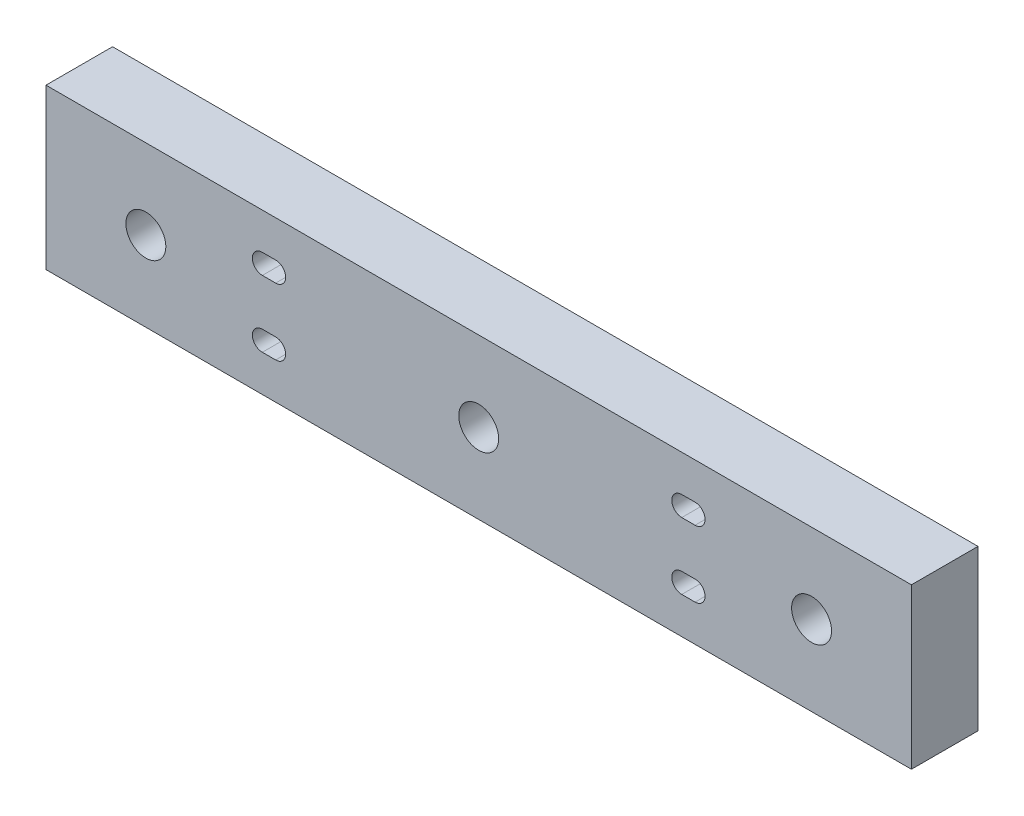
ISO-10303-21;
HEADER;
FILE_DESCRIPTION(('STEP AP214'),'2;1');
FILE_NAME('part.step','',(''),(''),'','','');
FILE_SCHEMA(('AUTOMOTIVE_DESIGN { 1 0 10303 214 1 1 1 1 }'));
ENDSEC;
DATA;
#1=APPLICATION_CONTEXT('core data for automotive mechanical design processes');
#2=APPLICATION_PROTOCOL_DEFINITION('international standard','automotive_design',2000,#1);
#3=PRODUCT_CONTEXT('',#1,'mechanical');
#4=PRODUCT('Part','Part','',(#3));
#5=PRODUCT_RELATED_PRODUCT_CATEGORY('part','',(#4));
#6=PRODUCT_DEFINITION_FORMATION('','',#4);
#7=PRODUCT_DEFINITION_CONTEXT('part definition',#1,'design');
#8=PRODUCT_DEFINITION('design','',#6,#7);
#9=PRODUCT_DEFINITION_SHAPE('','',#8);
#10=(LENGTH_UNIT() NAMED_UNIT(*) SI_UNIT(.MILLI.,.METRE.));
#11=(NAMED_UNIT(*) PLANE_ANGLE_UNIT() SI_UNIT($,.RADIAN.));
#12=(NAMED_UNIT(*) SI_UNIT($,.STERADIAN.) SOLID_ANGLE_UNIT());
#13=UNCERTAINTY_MEASURE_WITH_UNIT(LENGTH_MEASURE(1.E-05),#10,'distance_accuracy_value','');
#14=(GEOMETRIC_REPRESENTATION_CONTEXT(3) GLOBAL_UNCERTAINTY_ASSIGNED_CONTEXT((#13)) GLOBAL_UNIT_ASSIGNED_CONTEXT((#10,
#11,#12)) REPRESENTATION_CONTEXT('',''));
#15=CARTESIAN_POINT('',(0.,0.,0.));
#16=DIRECTION('',(0.,0.,1.));
#17=DIRECTION('',(1.,0.,0.));
#18=AXIS2_PLACEMENT_3D('',#15,#16,#17);
#19=CARTESIAN_POINT('',(0.,0.,0.));
#20=DIRECTION('',(0.,0.,-1.));
#21=DIRECTION('',(-1.,0.,0.));
#22=AXIS2_PLACEMENT_3D('',#19,#20,#21);
#23=PLANE('',#22);
#24=CARTESIAN_POINT('',(31.5,-5.,0.));
#25=DIRECTION('',(0.,0.,-1.));
#26=DIRECTION('',(-1.,0.,0.));
#27=AXIS2_PLACEMENT_3D('',#24,#25,#26);
#28=CIRCLE('',#27,4.);
#29=CARTESIAN_POINT('',(27.5,-5.,0.));
#30=VERTEX_POINT('',#29);
#31=EDGE_CURVE('E506',#30,#30,#28,.T.);
#32=ORIENTED_EDGE('',*,*,#31,.F.);
#33=EDGE_LOOP('',(#32));
#34=FACE_BOUND('',#33,.T.);
#35=CARTESIAN_POINT('',(-31.5,-5.,0.));
#36=DIRECTION('',(0.,0.,1.));
#37=DIRECTION('',(1.,0.,0.));
#38=AXIS2_PLACEMENT_3D('',#35,#36,#37);
#39=CIRCLE('',#38,4.);
#40=CARTESIAN_POINT('',(-27.5,-5.,0.));
#41=VERTEX_POINT('',#40);
#42=EDGE_CURVE('E512',#41,#41,#39,.T.);
#43=ORIENTED_EDGE('',*,*,#42,.T.);
#44=EDGE_LOOP('',(#43));
#45=FACE_BOUND('',#44,.T.);
#46=CARTESIAN_POINT('',(31.5,5.,0.));
#47=DIRECTION('',(0.,0.,-1.));
#48=DIRECTION('',(-1.,0.,0.));
#49=AXIS2_PLACEMENT_3D('',#46,#47,#48);
#50=CIRCLE('',#49,4.);
#51=CARTESIAN_POINT('',(27.5,5.,0.));
#52=VERTEX_POINT('',#51);
#53=EDGE_CURVE('E503',#52,#52,#50,.T.);
#54=ORIENTED_EDGE('',*,*,#53,.F.);
#55=EDGE_LOOP('',(#54));
#56=FACE_BOUND('',#55,.T.);
#57=CARTESIAN_POINT('',(-50.,0.,0.));
#58=DIRECTION('',(0.,0.,1.));
#59=DIRECTION('',(1.,0.,0.));
#60=AXIS2_PLACEMENT_3D('',#57,#58,#59);
#61=CIRCLE('',#60,3.);
#62=CARTESIAN_POINT('',(-47.,0.,0.));
#63=VERTEX_POINT('',#62);
#64=EDGE_CURVE('E257',#63,#63,#61,.T.);
#65=ORIENTED_EDGE('',*,*,#64,.T.);
#66=EDGE_LOOP('',(#65));
#67=FACE_BOUND('',#66,.T.);
#68=DIRECTION('',(0.,1.,0.));
#69=VECTOR('',#68,1.);
#70=CARTESIAN_POINT('',(65.,-12.,0.));
#71=LINE('',#70,#69);
#72=CARTESIAN_POINT('',(65.,-12.,0.));
#73=VERTEX_POINT('',#72);
#74=CARTESIAN_POINT('',(65.,12.,0.));
#75=VERTEX_POINT('',#74);
#76=EDGE_CURVE('E292',#73,#75,#71,.T.);
#77=ORIENTED_EDGE('',*,*,#76,.F.);
#78=DIRECTION('',(1.,0.,0.));
#79=VECTOR('',#78,1.);
#80=CARTESIAN_POINT('',(-65.,-12.,0.));
#81=LINE('',#80,#79);
#82=CARTESIAN_POINT('',(-65.,-12.,0.));
#83=VERTEX_POINT('',#82);
#84=EDGE_CURVE('E297',#83,#73,#81,.T.);
#85=ORIENTED_EDGE('',*,*,#84,.F.);
#86=DIRECTION('',(0.,-1.,0.));
#87=VECTOR('',#86,1.);
#88=CARTESIAN_POINT('',(-65.,-12.,0.));
#89=LINE('',#88,#87);
#90=CARTESIAN_POINT('',(-65.,12.,0.));
#91=VERTEX_POINT('',#90);
#92=EDGE_CURVE('E308',#91,#83,#89,.T.);
#93=ORIENTED_EDGE('',*,*,#92,.F.);
#94=DIRECTION('',(-1.,0.,0.));
#95=VECTOR('',#94,1.);
#96=CARTESIAN_POINT('',(-65.,12.,0.));
#97=LINE('',#96,#95);
#98=EDGE_CURVE('E306',#75,#91,#97,.T.);
#99=ORIENTED_EDGE('',*,*,#98,.F.);
#100=EDGE_LOOP('',(#77,#85,#93,#99));
#101=FACE_BOUND('',#100,.T.);
#102=CARTESIAN_POINT('',(0.,0.,0.));
#103=DIRECTION('',(0.,0.,1.));
#104=DIRECTION('',(1.,0.,0.));
#105=AXIS2_PLACEMENT_3D('',#102,#103,#104);
#106=CIRCLE('',#105,3.);
#107=CARTESIAN_POINT('',(3.,0.,0.));
#108=VERTEX_POINT('',#107);
#109=EDGE_CURVE('E263',#108,#108,#106,.T.);
#110=ORIENTED_EDGE('',*,*,#109,.T.);
#111=EDGE_LOOP('',(#110));
#112=FACE_BOUND('',#111,.T.);
#113=CARTESIAN_POINT('',(50.,0.,0.));
#114=DIRECTION('',(0.,0.,1.));
#115=DIRECTION('',(1.,0.,0.));
#116=AXIS2_PLACEMENT_3D('',#113,#114,#115);
#117=CIRCLE('',#116,3.);
#118=CARTESIAN_POINT('',(53.,0.,0.));
#119=VERTEX_POINT('',#118);
#120=EDGE_CURVE('E253',#119,#119,#117,.T.);
#121=ORIENTED_EDGE('',*,*,#120,.T.);
#122=EDGE_LOOP('',(#121));
#123=FACE_BOUND('',#122,.T.);
#124=CARTESIAN_POINT('',(-31.5,5.,0.));
#125=DIRECTION('',(0.,0.,1.));
#126=DIRECTION('',(1.,0.,0.));
#127=AXIS2_PLACEMENT_3D('',#124,#125,#126);
#128=CIRCLE('',#127,4.);
#129=CARTESIAN_POINT('',(-27.5,5.,0.));
#130=VERTEX_POINT('',#129);
#131=EDGE_CURVE('E511',#130,#130,#128,.T.);
#132=ORIENTED_EDGE('',*,*,#131,.T.);
#133=EDGE_LOOP('',(#132));
#134=FACE_BOUND('',#133,.T.);
#135=ADVANCED_FACE('F37',(#34,#45,#56,#67,#101,#112,#123,#134),#23,.T.);
#136=CARTESIAN_POINT('',(32.5,5.,10.));
#137=DIRECTION('',(0.,0.,-1.));
#138=DIRECTION('',(-1.,0.,0.));
#139=AXIS2_PLACEMENT_3D('',#136,#137,#138);
#140=CYLINDRICAL_SURFACE('',#139,1.5);
#141=DIRECTION('',(0.,0.,-1.));
#142=VECTOR('',#141,1.);
#143=CARTESIAN_POINT('',(32.5,6.5,10.));
#144=LINE('',#143,#142);
#145=CARTESIAN_POINT('',(32.5,6.5,10.));
#146=VERTEX_POINT('',#145);
#147=CARTESIAN_POINT('',(32.5,6.5,7.));
#148=VERTEX_POINT('',#147);
#149=EDGE_CURVE('E289',#146,#148,#144,.T.);
#150=ORIENTED_EDGE('',*,*,#149,.T.);
#151=CARTESIAN_POINT('',(32.5,5.,7.));
#152=DIRECTION('',(0.,0.,-1.));
#153=DIRECTION('',(-1.,0.,0.));
#154=AXIS2_PLACEMENT_3D('',#151,#152,#153);
#155=CIRCLE('',#154,1.5);
#156=CARTESIAN_POINT('',(32.5,3.49999999999999,7.));
#157=VERTEX_POINT('',#156);
#158=EDGE_CURVE('E349',#148,#157,#155,.T.);
#159=ORIENTED_EDGE('',*,*,#158,.T.);
#160=DIRECTION('',(0.,0.,-1.));
#161=VECTOR('',#160,1.);
#162=CARTESIAN_POINT('',(32.5,3.49999999999999,10.));
#163=LINE('',#162,#161);
#164=CARTESIAN_POINT('',(32.5,3.49999999999999,10.));
#165=VERTEX_POINT('',#164);
#166=EDGE_CURVE('E280',#165,#157,#163,.T.);
#167=ORIENTED_EDGE('',*,*,#166,.F.);
#168=CARTESIAN_POINT('',(32.5,5.,10.));
#169=DIRECTION('',(0.,0.,1.));
#170=DIRECTION('',(-1.,0.,0.));
#171=AXIS2_PLACEMENT_3D('',#168,#169,#170);
#172=CIRCLE('',#171,1.5);
#173=EDGE_CURVE('E269',#165,#146,#172,.T.);
#174=ORIENTED_EDGE('',*,*,#173,.T.);
#175=EDGE_LOOP('',(#150,#159,#167,#174));
#176=FACE_BOUND('',#175,.T.);
#177=ADVANCED_FACE('F405',(#176),#140,.F.);
#178=CARTESIAN_POINT('',(32.5,6.5,10.));
#179=DIRECTION('',(0.,-1.,0.));
#180=DIRECTION('',(0.,0.,-1.));
#181=AXIS2_PLACEMENT_3D('',#178,#179,#180);
#182=PLANE('',#181);
#183=DIRECTION('',(0.,0.,-1.));
#184=VECTOR('',#183,1.);
#185=CARTESIAN_POINT('',(30.5,6.5,10.));
#186=LINE('',#185,#184);
#187=CARTESIAN_POINT('',(30.5,6.5,10.));
#188=VERTEX_POINT('',#187);
#189=CARTESIAN_POINT('',(30.5,6.5,7.));
#190=VERTEX_POINT('',#189);
#191=EDGE_CURVE('E286',#188,#190,#186,.T.);
#192=ORIENTED_EDGE('',*,*,#191,.T.);
#193=DIRECTION('',(1.,0.,0.));
#194=VECTOR('',#193,1.);
#195=CARTESIAN_POINT('',(32.5,6.5,7.));
#196=LINE('',#195,#194);
#197=EDGE_CURVE('E342',#190,#148,#196,.T.);
#198=ORIENTED_EDGE('',*,*,#197,.T.);
#199=ORIENTED_EDGE('',*,*,#149,.F.);
#200=DIRECTION('',(-1.,0.,0.));
#201=VECTOR('',#200,1.);
#202=CARTESIAN_POINT('',(32.5,6.5,10.));
#203=LINE('',#202,#201);
#204=EDGE_CURVE('E273',#146,#188,#203,.T.);
#205=ORIENTED_EDGE('',*,*,#204,.T.);
#206=EDGE_LOOP('',(#192,#198,#199,#205));
#207=FACE_BOUND('',#206,.T.);
#208=ADVANCED_FACE('F411',(#207),#182,.T.);
#209=CARTESIAN_POINT('',(30.5,5.,10.));
#210=DIRECTION('',(0.,0.,-1.));
#211=DIRECTION('',(-1.,0.,0.));
#212=AXIS2_PLACEMENT_3D('',#209,#210,#211);
#213=CYLINDRICAL_SURFACE('',#212,1.5);
#214=DIRECTION('',(0.,0.,-1.));
#215=VECTOR('',#214,1.);
#216=CARTESIAN_POINT('',(30.5,3.49999999999999,10.));
#217=LINE('',#216,#215);
#218=CARTESIAN_POINT('',(30.5,3.49999999999999,10.));
#219=VERTEX_POINT('',#218);
#220=CARTESIAN_POINT('',(30.5,3.49999999999999,7.));
#221=VERTEX_POINT('',#220);
#222=EDGE_CURVE('E283',#219,#221,#217,.T.);
#223=ORIENTED_EDGE('',*,*,#222,.T.);
#224=CARTESIAN_POINT('',(30.5,5.,7.));
#225=DIRECTION('',(0.,0.,-1.));
#226=DIRECTION('',(-1.,0.,0.));
#227=AXIS2_PLACEMENT_3D('',#224,#225,#226);
#228=CIRCLE('',#227,1.5);
#229=EDGE_CURVE('E52',#221,#190,#228,.T.);
#230=ORIENTED_EDGE('',*,*,#229,.T.);
#231=ORIENTED_EDGE('',*,*,#191,.F.);
#232=CARTESIAN_POINT('',(30.5,5.,10.));
#233=DIRECTION('',(0.,0.,1.));
#234=DIRECTION('',(1.,0.,0.));
#235=AXIS2_PLACEMENT_3D('',#232,#233,#234);
#236=CIRCLE('',#235,1.5);
#237=EDGE_CURVE('E275',#188,#219,#236,.T.);
#238=ORIENTED_EDGE('',*,*,#237,.T.);
#239=EDGE_LOOP('',(#223,#230,#231,#238));
#240=FACE_BOUND('',#239,.T.);
#241=ADVANCED_FACE('F478',(#240),#213,.F.);
#242=CARTESIAN_POINT('',(32.5,3.49999999999999,10.));
#243=DIRECTION('',(0.,1.,0.));
#244=DIRECTION('',(0.,0.,1.));
#245=AXIS2_PLACEMENT_3D('',#242,#243,#244);
#246=PLANE('',#245);
#247=ORIENTED_EDGE('',*,*,#166,.T.);
#248=DIRECTION('',(-1.,0.,0.));
#249=VECTOR('',#248,1.);
#250=CARTESIAN_POINT('',(32.5,3.49999999999999,7.));
#251=LINE('',#250,#249);
#252=EDGE_CURVE('E11',#157,#221,#251,.T.);
#253=ORIENTED_EDGE('',*,*,#252,.T.);
#254=ORIENTED_EDGE('',*,*,#222,.F.);
#255=DIRECTION('',(1.,0.,0.));
#256=VECTOR('',#255,1.);
#257=CARTESIAN_POINT('',(32.5,3.49999999999999,10.));
#258=LINE('',#257,#256);
#259=EDGE_CURVE('E278',#219,#165,#258,.T.);
#260=ORIENTED_EDGE('',*,*,#259,.T.);
#261=EDGE_LOOP('',(#247,#253,#254,#260));
#262=FACE_BOUND('',#261,.T.);
#263=ADVANCED_FACE('F464',(#262),#246,.T.);
#264=CARTESIAN_POINT('',(32.5,-5.,10.));
#265=DIRECTION('',(0.,0.,-1.));
#266=DIRECTION('',(-1.,0.,0.));
#267=AXIS2_PLACEMENT_3D('',#264,#265,#266);
#268=CYLINDRICAL_SURFACE('',#267,1.5);
#269=DIRECTION('',(0.,0.,-1.));
#270=VECTOR('',#269,1.);
#271=CARTESIAN_POINT('',(32.5,-3.49999999999999,10.));
#272=LINE('',#271,#270);
#273=CARTESIAN_POINT('',(32.5,-3.49999999999999,10.));
#274=VERTEX_POINT('',#273);
#275=CARTESIAN_POINT('',(32.5,-3.49999999999999,7.));
#276=VERTEX_POINT('',#275);
#277=EDGE_CURVE('E250',#274,#276,#272,.T.);
#278=ORIENTED_EDGE('',*,*,#277,.T.);
#279=CARTESIAN_POINT('',(32.5,-5.,7.));
#280=DIRECTION('',(0.,0.,-1.));
#281=DIRECTION('',(-1.,0.,0.));
#282=AXIS2_PLACEMENT_3D('',#279,#280,#281);
#283=CIRCLE('',#282,1.5);
#284=CARTESIAN_POINT('',(32.5,-6.5,7.));
#285=VERTEX_POINT('',#284);
#286=EDGE_CURVE('E338',#276,#285,#283,.T.);
#287=ORIENTED_EDGE('',*,*,#286,.T.);
#288=DIRECTION('',(0.,0.,-1.));
#289=VECTOR('',#288,1.);
#290=CARTESIAN_POINT('',(32.5,-6.5,10.));
#291=LINE('',#290,#289);
#292=CARTESIAN_POINT('',(32.5,-6.5,10.));
#293=VERTEX_POINT('',#292);
#294=EDGE_CURVE('E241',#293,#285,#291,.T.);
#295=ORIENTED_EDGE('',*,*,#294,.F.);
#296=CARTESIAN_POINT('',(32.5,-5.,10.));
#297=DIRECTION('',(0.,0.,1.));
#298=DIRECTION('',(1.,0.,0.));
#299=AXIS2_PLACEMENT_3D('',#296,#297,#298);
#300=CIRCLE('',#299,1.5);
#301=EDGE_CURVE('E232',#293,#274,#300,.T.);
#302=ORIENTED_EDGE('',*,*,#301,.T.);
#303=EDGE_LOOP('',(#278,#287,#295,#302));
#304=FACE_BOUND('',#303,.T.);
#305=ADVANCED_FACE('F336',(#304),#268,.F.);
#306=CARTESIAN_POINT('',(32.5,-3.49999999999999,10.));
#307=DIRECTION('',(0.,-1.,0.));
#308=DIRECTION('',(0.,0.,-1.));
#309=AXIS2_PLACEMENT_3D('',#306,#307,#308);
#310=PLANE('',#309);
#311=DIRECTION('',(0.,0.,-1.));
#312=VECTOR('',#311,1.);
#313=CARTESIAN_POINT('',(30.5,-3.49999999999999,10.));
#314=LINE('',#313,#312);
#315=CARTESIAN_POINT('',(30.5,-3.49999999999999,10.));
#316=VERTEX_POINT('',#315);
#317=CARTESIAN_POINT('',(30.5,-3.49999999999999,7.));
#318=VERTEX_POINT('',#317);
#319=EDGE_CURVE('E247',#316,#318,#314,.T.);
#320=ORIENTED_EDGE('',*,*,#319,.T.);
#321=DIRECTION('',(1.,0.,0.));
#322=VECTOR('',#321,1.);
#323=CARTESIAN_POINT('',(32.5,-3.49999999999999,7.));
#324=LINE('',#323,#322);
#325=EDGE_CURVE('E340',#318,#276,#324,.T.);
#326=ORIENTED_EDGE('',*,*,#325,.T.);
#327=ORIENTED_EDGE('',*,*,#277,.F.);
#328=DIRECTION('',(-1.,0.,0.));
#329=VECTOR('',#328,1.);
#330=CARTESIAN_POINT('',(32.5,-3.49999999999999,10.));
#331=LINE('',#330,#329);
#332=EDGE_CURVE('E234',#274,#316,#331,.T.);
#333=ORIENTED_EDGE('',*,*,#332,.T.);
#334=EDGE_LOOP('',(#320,#326,#327,#333));
#335=FACE_BOUND('',#334,.T.);
#336=ADVANCED_FACE('F454',(#335),#310,.T.);
#337=CARTESIAN_POINT('',(30.5,-5.,10.));
#338=DIRECTION('',(0.,0.,-1.));
#339=DIRECTION('',(-1.,0.,0.));
#340=AXIS2_PLACEMENT_3D('',#337,#338,#339);
#341=CYLINDRICAL_SURFACE('',#340,1.5);
#342=DIRECTION('',(0.,0.,-1.));
#343=VECTOR('',#342,1.);
#344=CARTESIAN_POINT('',(30.5,-6.5,10.));
#345=LINE('',#344,#343);
#346=CARTESIAN_POINT('',(30.5,-6.5,10.));
#347=VERTEX_POINT('',#346);
#348=CARTESIAN_POINT('',(30.5,-6.5,7.));
#349=VERTEX_POINT('',#348);
#350=EDGE_CURVE('E244',#347,#349,#345,.T.);
#351=ORIENTED_EDGE('',*,*,#350,.T.);
#352=CARTESIAN_POINT('',(30.5,-5.,7.));
#353=DIRECTION('',(0.,0.,-1.));
#354=DIRECTION('',(-1.,0.,0.));
#355=AXIS2_PLACEMENT_3D('',#352,#353,#354);
#356=CIRCLE('',#355,1.5);
#357=EDGE_CURVE('E59',#349,#318,#356,.T.);
#358=ORIENTED_EDGE('',*,*,#357,.T.);
#359=ORIENTED_EDGE('',*,*,#319,.F.);
#360=CARTESIAN_POINT('',(30.5,-5.,10.));
#361=DIRECTION('',(0.,0.,1.));
#362=DIRECTION('',(-1.,0.,0.));
#363=AXIS2_PLACEMENT_3D('',#360,#361,#362);
#364=CIRCLE('',#363,1.5);
#365=EDGE_CURVE('E236',#316,#347,#364,.T.);
#366=ORIENTED_EDGE('',*,*,#365,.T.);
#367=EDGE_LOOP('',(#351,#358,#359,#366));
#368=FACE_BOUND('',#367,.T.);
#369=ADVANCED_FACE('F326',(#368),#341,.F.);
#370=CARTESIAN_POINT('',(32.5,-6.5,10.));
#371=DIRECTION('',(0.,1.,0.));
#372=DIRECTION('',(0.,0.,1.));
#373=AXIS2_PLACEMENT_3D('',#370,#371,#372);
#374=PLANE('',#373);
#375=ORIENTED_EDGE('',*,*,#294,.T.);
#376=DIRECTION('',(-1.,0.,0.));
#377=VECTOR('',#376,1.);
#378=CARTESIAN_POINT('',(32.5,-6.5,7.));
#379=LINE('',#378,#377);
#380=EDGE_CURVE('E45',#285,#349,#379,.T.);
#381=ORIENTED_EDGE('',*,*,#380,.T.);
#382=ORIENTED_EDGE('',*,*,#350,.F.);
#383=DIRECTION('',(1.,0.,0.));
#384=VECTOR('',#383,1.);
#385=CARTESIAN_POINT('',(32.5,-6.5,10.));
#386=LINE('',#385,#384);
#387=EDGE_CURVE('E239',#347,#293,#386,.T.);
#388=ORIENTED_EDGE('',*,*,#387,.T.);
#389=EDGE_LOOP('',(#375,#381,#382,#388));
#390=FACE_BOUND('',#389,.T.);
#391=ADVANCED_FACE('F322',(#390),#374,.T.);
#392=CARTESIAN_POINT('',(0.,0.,10.));
#393=DIRECTION('',(0.,0.,-1.));
#394=DIRECTION('',(-1.,0.,0.));
#395=AXIS2_PLACEMENT_3D('',#392,#393,#394);
#396=PLANE('',#395);
#397=CARTESIAN_POINT('',(-32.5,5.,10.));
#398=DIRECTION('',(0.,0.,1.));
#399=DIRECTION('',(1.,0.,0.));
#400=AXIS2_PLACEMENT_3D('',#397,#398,#399);
#401=CIRCLE('',#400,1.5);
#402=CARTESIAN_POINT('',(-32.5,6.5,10.));
#403=VERTEX_POINT('',#402);
#404=CARTESIAN_POINT('',(-32.5,3.49999999999999,10.));
#405=VERTEX_POINT('',#404);
#406=EDGE_CURVE('E211',#403,#405,#401,.T.);
#407=ORIENTED_EDGE('',*,*,#406,.F.);
#408=DIRECTION('',(-1.,0.,0.));
#409=VECTOR('',#408,1.);
#410=CARTESIAN_POINT('',(-32.5,6.5,10.));
#411=LINE('',#410,#409);
#412=CARTESIAN_POINT('',(-30.5,6.5,10.));
#413=VERTEX_POINT('',#412);
#414=EDGE_CURVE('E218',#413,#403,#411,.T.);
#415=ORIENTED_EDGE('',*,*,#414,.F.);
#416=CARTESIAN_POINT('',(-30.5,5.,10.));
#417=DIRECTION('',(0.,0.,1.));
#418=DIRECTION('',(-1.,0.,0.));
#419=AXIS2_PLACEMENT_3D('',#416,#417,#418);
#420=CIRCLE('',#419,1.5);
#421=CARTESIAN_POINT('',(-30.5,3.49999999999999,10.));
#422=VERTEX_POINT('',#421);
#423=EDGE_CURVE('E215',#422,#413,#420,.T.);
#424=ORIENTED_EDGE('',*,*,#423,.F.);
#425=DIRECTION('',(1.,0.,0.));
#426=VECTOR('',#425,1.);
#427=CARTESIAN_POINT('',(-32.5,3.49999999999999,10.));
#428=LINE('',#427,#426);
#429=EDGE_CURVE('E213',#405,#422,#428,.T.);
#430=ORIENTED_EDGE('',*,*,#429,.F.);
#431=EDGE_LOOP('',(#407,#415,#424,#430));
#432=FACE_BOUND('',#431,.T.);
#433=CARTESIAN_POINT('',(50.,0.,10.));
#434=DIRECTION('',(0.,0.,1.));
#435=DIRECTION('',(1.,0.,0.));
#436=AXIS2_PLACEMENT_3D('',#433,#434,#435);
#437=CIRCLE('',#436,3.);
#438=CARTESIAN_POINT('',(53.,0.,10.));
#439=VERTEX_POINT('',#438);
#440=EDGE_CURVE('E254',#439,#439,#437,.T.);
#441=ORIENTED_EDGE('',*,*,#440,.F.);
#442=EDGE_LOOP('',(#441));
#443=FACE_BOUND('',#442,.T.);
#444=CARTESIAN_POINT('',(-50.,0.,10.));
#445=DIRECTION('',(0.,0.,1.));
#446=DIRECTION('',(1.,0.,0.));
#447=AXIS2_PLACEMENT_3D('',#444,#445,#446);
#448=CIRCLE('',#447,3.);
#449=CARTESIAN_POINT('',(-47.,0.,10.));
#450=VERTEX_POINT('',#449);
#451=EDGE_CURVE('E260',#450,#450,#448,.T.);
#452=ORIENTED_EDGE('',*,*,#451,.F.);
#453=EDGE_LOOP('',(#452));
#454=FACE_BOUND('',#453,.T.);
#455=CARTESIAN_POINT('',(0.,0.,10.));
#456=DIRECTION('',(0.,0.,1.));
#457=DIRECTION('',(1.,0.,0.));
#458=AXIS2_PLACEMENT_3D('',#455,#456,#457);
#459=CIRCLE('',#458,3.);
#460=CARTESIAN_POINT('',(3.,0.,10.));
#461=VERTEX_POINT('',#460);
#462=EDGE_CURVE('E266',#461,#461,#459,.T.);
#463=ORIENTED_EDGE('',*,*,#462,.F.);
#464=EDGE_LOOP('',(#463));
#465=FACE_BOUND('',#464,.T.);
#466=ORIENTED_EDGE('',*,*,#173,.F.);
#467=ORIENTED_EDGE('',*,*,#259,.F.);
#468=ORIENTED_EDGE('',*,*,#237,.F.);
#469=ORIENTED_EDGE('',*,*,#204,.F.);
#470=EDGE_LOOP('',(#466,#467,#468,#469));
#471=FACE_BOUND('',#470,.T.);
#472=DIRECTION('',(0.,1.,0.));
#473=VECTOR('',#472,1.);
#474=CARTESIAN_POINT('',(65.,-12.,10.));
#475=LINE('',#474,#473);
#476=CARTESIAN_POINT('',(65.,-12.,10.));
#477=VERTEX_POINT('',#476);
#478=CARTESIAN_POINT('',(65.,12.,10.));
#479=VERTEX_POINT('',#478);
#480=EDGE_CURVE('E293',#477,#479,#475,.T.);
#481=ORIENTED_EDGE('',*,*,#480,.T.);
#482=DIRECTION('',(-1.,0.,0.));
#483=VECTOR('',#482,1.);
#484=CARTESIAN_POINT('',(-65.,12.,10.));
#485=LINE('',#484,#483);
#486=CARTESIAN_POINT('',(-65.,12.,10.));
#487=VERTEX_POINT('',#486);
#488=EDGE_CURVE('E296',#479,#487,#485,.T.);
#489=ORIENTED_EDGE('',*,*,#488,.T.);
#490=DIRECTION('',(0.,-1.,0.));
#491=VECTOR('',#490,1.);
#492=CARTESIAN_POINT('',(-65.,-12.,10.));
#493=LINE('',#492,#491);
#494=CARTESIAN_POINT('',(-65.,-12.,10.));
#495=VERTEX_POINT('',#494);
#496=EDGE_CURVE('E299',#487,#495,#493,.T.);
#497=ORIENTED_EDGE('',*,*,#496,.T.);
#498=DIRECTION('',(1.,0.,0.));
#499=VECTOR('',#498,1.);
#500=CARTESIAN_POINT('',(-65.,-12.,10.));
#501=LINE('',#500,#499);
#502=EDGE_CURVE('E301',#495,#477,#501,.T.);
#503=ORIENTED_EDGE('',*,*,#502,.T.);
#504=EDGE_LOOP('',(#481,#489,#497,#503));
#505=FACE_BOUND('',#504,.T.);
#506=ORIENTED_EDGE('',*,*,#301,.F.);
#507=ORIENTED_EDGE('',*,*,#387,.F.);
#508=ORIENTED_EDGE('',*,*,#365,.F.);
#509=ORIENTED_EDGE('',*,*,#332,.F.);
#510=EDGE_LOOP('',(#506,#507,#508,#509));
#511=FACE_BOUND('',#510,.T.);
#512=CARTESIAN_POINT('',(-32.5,-5.,10.));
#513=DIRECTION('',(0.,0.,1.));
#514=DIRECTION('',(-1.,0.,0.));
#515=AXIS2_PLACEMENT_3D('',#512,#513,#514);
#516=CIRCLE('',#515,1.5);
#517=CARTESIAN_POINT('',(-32.5,-3.49999999999999,10.));
#518=VERTEX_POINT('',#517);
#519=CARTESIAN_POINT('',(-32.5,-6.5,10.));
#520=VERTEX_POINT('',#519);
#521=EDGE_CURVE('E352',#518,#520,#516,.T.);
#522=ORIENTED_EDGE('',*,*,#521,.F.);
#523=DIRECTION('',(-1.,0.,0.));
#524=VECTOR('',#523,1.);
#525=CARTESIAN_POINT('',(-32.5,-3.49999999999999,10.));
#526=LINE('',#525,#524);
#527=CARTESIAN_POINT('',(-30.5,-3.49999999999999,10.));
#528=VERTEX_POINT('',#527);
#529=EDGE_CURVE('E199',#528,#518,#526,.T.);
#530=ORIENTED_EDGE('',*,*,#529,.F.);
#531=CARTESIAN_POINT('',(-30.5,-5.,10.));
#532=DIRECTION('',(0.,0.,1.));
#533=DIRECTION('',(1.,0.,0.));
#534=AXIS2_PLACEMENT_3D('',#531,#532,#533);
#535=CIRCLE('',#534,1.5);
#536=CARTESIAN_POINT('',(-30.5,-6.5,10.));
#537=VERTEX_POINT('',#536);
#538=EDGE_CURVE('E204',#537,#528,#535,.T.);
#539=ORIENTED_EDGE('',*,*,#538,.F.);
#540=DIRECTION('',(1.,0.,0.));
#541=VECTOR('',#540,1.);
#542=CARTESIAN_POINT('',(-32.5,-6.5,10.));
#543=LINE('',#542,#541);
#544=EDGE_CURVE('E354',#520,#537,#543,.T.);
#545=ORIENTED_EDGE('',*,*,#544,.F.);
#546=EDGE_LOOP('',(#522,#530,#539,#545));
#547=FACE_BOUND('',#546,.T.);
#548=ADVANCED_FACE('F333',(#432,#443,#454,#465,#471,#505,#511,#547),#396,.F.);
#549=CARTESIAN_POINT('',(65.,-12.,10.));
#550=DIRECTION('',(-1.,0.,0.));
#551=DIRECTION('',(0.,0.,1.));
#552=AXIS2_PLACEMENT_3D('',#549,#550,#551);
#553=PLANE('',#552);
#554=ORIENTED_EDGE('',*,*,#76,.T.);
#555=DIRECTION('',(0.,0.,-1.));
#556=VECTOR('',#555,1.);
#557=CARTESIAN_POINT('',(65.,12.,10.));
#558=LINE('',#557,#556);
#559=EDGE_CURVE('E184',#479,#75,#558,.T.);
#560=ORIENTED_EDGE('',*,*,#559,.F.);
#561=ORIENTED_EDGE('',*,*,#480,.F.);
#562=DIRECTION('',(0.,0.,-1.));
#563=VECTOR('',#562,1.);
#564=CARTESIAN_POINT('',(65.,-12.,10.));
#565=LINE('',#564,#563);
#566=EDGE_CURVE('E303',#477,#73,#565,.T.);
#567=ORIENTED_EDGE('',*,*,#566,.T.);
#568=EDGE_LOOP('',(#554,#560,#561,#567));
#569=FACE_BOUND('',#568,.T.);
#570=ADVANCED_FACE('F39',(#569),#553,.F.);
#571=CARTESIAN_POINT('',(-65.,12.,10.));
#572=DIRECTION('',(0.,-1.,0.));
#573=DIRECTION('',(0.,0.,-1.));
#574=AXIS2_PLACEMENT_3D('',#571,#572,#573);
#575=PLANE('',#574);
#576=ORIENTED_EDGE('',*,*,#98,.T.);
#577=DIRECTION('',(0.,0.,-1.));
#578=VECTOR('',#577,1.);
#579=CARTESIAN_POINT('',(-65.,12.,10.));
#580=LINE('',#579,#578);
#581=EDGE_CURVE('E316',#487,#91,#580,.T.);
#582=ORIENTED_EDGE('',*,*,#581,.F.);
#583=ORIENTED_EDGE('',*,*,#488,.F.);
#584=ORIENTED_EDGE('',*,*,#559,.T.);
#585=EDGE_LOOP('',(#576,#582,#583,#584));
#586=FACE_BOUND('',#585,.T.);
#587=ADVANCED_FACE('F425',(#586),#575,.F.);
#588=CARTESIAN_POINT('',(-65.,-12.,10.));
#589=DIRECTION('',(1.,0.,0.));
#590=DIRECTION('',(0.,0.,-1.));
#591=AXIS2_PLACEMENT_3D('',#588,#589,#590);
#592=PLANE('',#591);
#593=ORIENTED_EDGE('',*,*,#92,.T.);
#594=DIRECTION('',(0.,0.,-1.));
#595=VECTOR('',#594,1.);
#596=CARTESIAN_POINT('',(-65.,-12.,10.));
#597=LINE('',#596,#595);
#598=EDGE_CURVE('E313',#495,#83,#597,.T.);
#599=ORIENTED_EDGE('',*,*,#598,.F.);
#600=ORIENTED_EDGE('',*,*,#496,.F.);
#601=ORIENTED_EDGE('',*,*,#581,.T.);
#602=EDGE_LOOP('',(#593,#599,#600,#601));
#603=FACE_BOUND('',#602,.T.);
#604=ADVANCED_FACE('F422',(#603),#592,.F.);
#605=CARTESIAN_POINT('',(-65.,-12.,10.));
#606=DIRECTION('',(0.,1.,0.));
#607=DIRECTION('',(0.,0.,1.));
#608=AXIS2_PLACEMENT_3D('',#605,#606,#607);
#609=PLANE('',#608);
#610=ORIENTED_EDGE('',*,*,#84,.T.);
#611=ORIENTED_EDGE('',*,*,#566,.F.);
#612=ORIENTED_EDGE('',*,*,#502,.F.);
#613=ORIENTED_EDGE('',*,*,#598,.T.);
#614=EDGE_LOOP('',(#610,#611,#612,#613));
#615=FACE_BOUND('',#614,.T.);
#616=ADVANCED_FACE('F418',(#615),#609,.F.);
#617=CARTESIAN_POINT('',(0.,0.,10.));
#618=DIRECTION('',(0.,0.,-1.));
#619=DIRECTION('',(-1.,0.,0.));
#620=AXIS2_PLACEMENT_3D('',#617,#618,#619);
#621=CYLINDRICAL_SURFACE('',#620,3.);
#622=ORIENTED_EDGE('',*,*,#462,.T.);
#623=EDGE_LOOP('',(#622));
#624=FACE_BOUND('',#623,.T.);
#625=ORIENTED_EDGE('',*,*,#109,.F.);
#626=EDGE_LOOP('',(#625));
#627=FACE_BOUND('',#626,.T.);
#628=ADVANCED_FACE('F421',(#624,#627),#621,.F.);
#629=CARTESIAN_POINT('',(-50.,0.,10.));
#630=DIRECTION('',(0.,0.,-1.));
#631=DIRECTION('',(-1.,0.,0.));
#632=AXIS2_PLACEMENT_3D('',#629,#630,#631);
#633=CYLINDRICAL_SURFACE('',#632,3.);
#634=ORIENTED_EDGE('',*,*,#451,.T.);
#635=EDGE_LOOP('',(#634));
#636=FACE_BOUND('',#635,.T.);
#637=ORIENTED_EDGE('',*,*,#64,.F.);
#638=EDGE_LOOP('',(#637));
#639=FACE_BOUND('',#638,.T.);
#640=ADVANCED_FACE('F468',(#636,#639),#633,.F.);
#641=CARTESIAN_POINT('',(50.,0.,10.));
#642=DIRECTION('',(0.,0.,-1.));
#643=DIRECTION('',(-1.,0.,0.));
#644=AXIS2_PLACEMENT_3D('',#641,#642,#643);
#645=CYLINDRICAL_SURFACE('',#644,3.);
#646=ORIENTED_EDGE('',*,*,#440,.T.);
#647=EDGE_LOOP('',(#646));
#648=FACE_BOUND('',#647,.T.);
#649=ORIENTED_EDGE('',*,*,#120,.F.);
#650=EDGE_LOOP('',(#649));
#651=FACE_BOUND('',#650,.T.);
#652=ADVANCED_FACE('F465',(#648,#651),#645,.F.);
#653=CARTESIAN_POINT('',(-32.5,5.,10.));
#654=DIRECTION('',(0.,0.,-1.));
#655=DIRECTION('',(-1.,0.,0.));
#656=AXIS2_PLACEMENT_3D('',#653,#654,#655);
#657=CYLINDRICAL_SURFACE('',#656,1.5);
#658=CARTESIAN_POINT('',(-32.5,5.,7.));
#659=DIRECTION('',(0.,0.,1.));
#660=DIRECTION('',(1.,0.,0.));
#661=AXIS2_PLACEMENT_3D('',#658,#659,#660);
#662=CIRCLE('',#661,1.5);
#663=CARTESIAN_POINT('',(-32.5,6.5,7.));
#664=VERTEX_POINT('',#663);
#665=CARTESIAN_POINT('',(-32.5,3.49999999999999,7.));
#666=VERTEX_POINT('',#665);
#667=EDGE_CURVE('E371',#664,#666,#662,.T.);
#668=ORIENTED_EDGE('',*,*,#667,.F.);
#669=DIRECTION('',(0.,0.,-1.));
#670=VECTOR('',#669,1.);
#671=CARTESIAN_POINT('',(-32.5,6.5,10.));
#672=LINE('',#671,#670);
#673=EDGE_CURVE('E220',#403,#664,#672,.T.);
#674=ORIENTED_EDGE('',*,*,#673,.F.);
#675=ORIENTED_EDGE('',*,*,#406,.T.);
#676=DIRECTION('',(0.,0.,-1.));
#677=VECTOR('',#676,1.);
#678=CARTESIAN_POINT('',(-32.5,3.49999999999999,10.));
#679=LINE('',#678,#677);
#680=EDGE_CURVE('E229',#405,#666,#679,.T.);
#681=ORIENTED_EDGE('',*,*,#680,.T.);
#682=EDGE_LOOP('',(#668,#674,#675,#681));
#683=FACE_BOUND('',#682,.T.);
#684=ADVANCED_FACE('F386',(#683),#657,.F.);
#685=CARTESIAN_POINT('',(-32.5,3.49999999999999,10.));
#686=DIRECTION('',(0.,1.,0.));
#687=DIRECTION('',(0.,0.,1.));
#688=AXIS2_PLACEMENT_3D('',#685,#686,#687);
#689=PLANE('',#688);
#690=DIRECTION('',(1.,0.,0.));
#691=VECTOR('',#690,1.);
#692=CARTESIAN_POINT('',(-32.5,3.49999999999999,7.));
#693=LINE('',#692,#691);
#694=CARTESIAN_POINT('',(-30.5,3.49999999999999,7.));
#695=VERTEX_POINT('',#694);
#696=EDGE_CURVE('E369',#666,#695,#693,.T.);
#697=ORIENTED_EDGE('',*,*,#696,.F.);
#698=ORIENTED_EDGE('',*,*,#680,.F.);
#699=ORIENTED_EDGE('',*,*,#429,.T.);
#700=DIRECTION('',(0.,0.,-1.));
#701=VECTOR('',#700,1.);
#702=CARTESIAN_POINT('',(-30.5,3.49999999999999,10.));
#703=LINE('',#702,#701);
#704=EDGE_CURVE('E226',#422,#695,#703,.T.);
#705=ORIENTED_EDGE('',*,*,#704,.T.);
#706=EDGE_LOOP('',(#697,#698,#699,#705));
#707=FACE_BOUND('',#706,.T.);
#708=ADVANCED_FACE('F383',(#707),#689,.T.);
#709=CARTESIAN_POINT('',(-30.5,5.,10.));
#710=DIRECTION('',(0.,0.,-1.));
#711=DIRECTION('',(-1.,0.,0.));
#712=AXIS2_PLACEMENT_3D('',#709,#710,#711);
#713=CYLINDRICAL_SURFACE('',#712,1.5);
#714=CARTESIAN_POINT('',(-30.5,5.,7.));
#715=DIRECTION('',(0.,0.,1.));
#716=DIRECTION('',(1.,0.,0.));
#717=AXIS2_PLACEMENT_3D('',#714,#715,#716);
#718=CIRCLE('',#717,1.5);
#719=CARTESIAN_POINT('',(-30.5,6.5,7.));
#720=VERTEX_POINT('',#719);
#721=EDGE_CURVE('E194',#695,#720,#718,.T.);
#722=ORIENTED_EDGE('',*,*,#721,.F.);
#723=ORIENTED_EDGE('',*,*,#704,.F.);
#724=ORIENTED_EDGE('',*,*,#423,.T.);
#725=DIRECTION('',(0.,0.,-1.));
#726=VECTOR('',#725,1.);
#727=CARTESIAN_POINT('',(-30.5,6.5,10.));
#728=LINE('',#727,#726);
#729=EDGE_CURVE('E223',#413,#720,#728,.T.);
#730=ORIENTED_EDGE('',*,*,#729,.T.);
#731=EDGE_LOOP('',(#722,#723,#724,#730));
#732=FACE_BOUND('',#731,.T.);
#733=ADVANCED_FACE('F393',(#732),#713,.F.);
#734=CARTESIAN_POINT('',(-32.5,6.5,10.));
#735=DIRECTION('',(0.,-1.,0.));
#736=DIRECTION('',(0.,0.,-1.));
#737=AXIS2_PLACEMENT_3D('',#734,#735,#736);
#738=PLANE('',#737);
#739=DIRECTION('',(-1.,0.,0.));
#740=VECTOR('',#739,1.);
#741=CARTESIAN_POINT('',(-32.5,6.5,7.));
#742=LINE('',#741,#740);
#743=EDGE_CURVE('E183',#720,#664,#742,.T.);
#744=ORIENTED_EDGE('',*,*,#743,.F.);
#745=ORIENTED_EDGE('',*,*,#729,.F.);
#746=ORIENTED_EDGE('',*,*,#414,.T.);
#747=ORIENTED_EDGE('',*,*,#673,.T.);
#748=EDGE_LOOP('',(#744,#745,#746,#747));
#749=FACE_BOUND('',#748,.T.);
#750=ADVANCED_FACE('F395',(#749),#738,.T.);
#751=CARTESIAN_POINT('',(-32.5,-5.,10.));
#752=DIRECTION('',(0.,0.,-1.));
#753=DIRECTION('',(-1.,0.,0.));
#754=AXIS2_PLACEMENT_3D('',#751,#752,#753);
#755=CYLINDRICAL_SURFACE('',#754,1.5);
#756=CARTESIAN_POINT('',(-32.5,-5.,7.));
#757=DIRECTION('',(0.,0.,1.));
#758=DIRECTION('',(1.,0.,0.));
#759=AXIS2_PLACEMENT_3D('',#756,#757,#758);
#760=CIRCLE('',#759,1.5);
#761=CARTESIAN_POINT('',(-32.5,-3.49999999999999,7.));
#762=VERTEX_POINT('',#761);
#763=CARTESIAN_POINT('',(-32.5,-6.5,7.));
#764=VERTEX_POINT('',#763);
#765=EDGE_CURVE('E176',#762,#764,#760,.T.);
#766=ORIENTED_EDGE('',*,*,#765,.F.);
#767=DIRECTION('',(0.,0.,-1.));
#768=VECTOR('',#767,1.);
#769=CARTESIAN_POINT('',(-32.5,-3.49999999999999,10.));
#770=LINE('',#769,#768);
#771=EDGE_CURVE('E190',#518,#762,#770,.T.);
#772=ORIENTED_EDGE('',*,*,#771,.F.);
#773=ORIENTED_EDGE('',*,*,#521,.T.);
#774=DIRECTION('',(0.,0.,-1.));
#775=VECTOR('',#774,1.);
#776=CARTESIAN_POINT('',(-32.5,-6.5,10.));
#777=LINE('',#776,#775);
#778=EDGE_CURVE('E193',#520,#764,#777,.T.);
#779=ORIENTED_EDGE('',*,*,#778,.T.);
#780=EDGE_LOOP('',(#766,#772,#773,#779));
#781=FACE_BOUND('',#780,.T.);
#782=ADVANCED_FACE('F189',(#781),#755,.F.);
#783=CARTESIAN_POINT('',(-32.5,-6.5,10.));
#784=DIRECTION('',(0.,1.,0.));
#785=DIRECTION('',(0.,0.,1.));
#786=AXIS2_PLACEMENT_3D('',#783,#784,#785);
#787=PLANE('',#786);
#788=DIRECTION('',(1.,0.,0.));
#789=VECTOR('',#788,1.);
#790=CARTESIAN_POINT('',(-32.5,-6.5,7.));
#791=LINE('',#790,#789);
#792=CARTESIAN_POINT('',(-30.5,-6.5,7.));
#793=VERTEX_POINT('',#792);
#794=EDGE_CURVE('E195',#764,#793,#791,.T.);
#795=ORIENTED_EDGE('',*,*,#794,.F.);
#796=ORIENTED_EDGE('',*,*,#778,.F.);
#797=ORIENTED_EDGE('',*,*,#544,.T.);
#798=DIRECTION('',(0.,0.,-1.));
#799=VECTOR('',#798,1.);
#800=CARTESIAN_POINT('',(-30.5,-6.5,10.));
#801=LINE('',#800,#799);
#802=EDGE_CURVE('E202',#537,#793,#801,.T.);
#803=ORIENTED_EDGE('',*,*,#802,.T.);
#804=EDGE_LOOP('',(#795,#796,#797,#803));
#805=FACE_BOUND('',#804,.T.);
#806=ADVANCED_FACE('F362',(#805),#787,.T.);
#807=CARTESIAN_POINT('',(-30.5,-5.,10.));
#808=DIRECTION('',(0.,0.,-1.));
#809=DIRECTION('',(-1.,0.,0.));
#810=AXIS2_PLACEMENT_3D('',#807,#808,#809);
#811=CYLINDRICAL_SURFACE('',#810,1.5);
#812=CARTESIAN_POINT('',(-30.5,-5.,7.));
#813=DIRECTION('',(0.,0.,1.));
#814=DIRECTION('',(1.,0.,0.));
#815=AXIS2_PLACEMENT_3D('',#812,#813,#814);
#816=CIRCLE('',#815,1.5);
#817=CARTESIAN_POINT('',(-30.5,-3.49999999999999,7.));
#818=VERTEX_POINT('',#817);
#819=EDGE_CURVE('E179',#793,#818,#816,.T.);
#820=ORIENTED_EDGE('',*,*,#819,.F.);
#821=ORIENTED_EDGE('',*,*,#802,.F.);
#822=ORIENTED_EDGE('',*,*,#538,.T.);
#823=DIRECTION('',(0.,0.,-1.));
#824=VECTOR('',#823,1.);
#825=CARTESIAN_POINT('',(-30.5,-3.49999999999999,10.));
#826=LINE('',#825,#824);
#827=EDGE_CURVE('E200',#528,#818,#826,.T.);
#828=ORIENTED_EDGE('',*,*,#827,.T.);
#829=EDGE_LOOP('',(#820,#821,#822,#828));
#830=FACE_BOUND('',#829,.T.);
#831=ADVANCED_FACE('F359',(#830),#811,.F.);
#832=CARTESIAN_POINT('',(-32.5,-3.49999999999999,10.));
#833=DIRECTION('',(0.,-1.,0.));
#834=DIRECTION('',(0.,0.,-1.));
#835=AXIS2_PLACEMENT_3D('',#832,#833,#834);
#836=PLANE('',#835);
#837=DIRECTION('',(-1.,0.,0.));
#838=VECTOR('',#837,1.);
#839=CARTESIAN_POINT('',(-32.5,-3.49999999999999,7.));
#840=LINE('',#839,#838);
#841=EDGE_CURVE('E172',#818,#762,#840,.T.);
#842=ORIENTED_EDGE('',*,*,#841,.F.);
#843=ORIENTED_EDGE('',*,*,#827,.F.);
#844=ORIENTED_EDGE('',*,*,#529,.T.);
#845=ORIENTED_EDGE('',*,*,#771,.T.);
#846=EDGE_LOOP('',(#842,#843,#844,#845));
#847=FACE_BOUND('',#846,.T.);
#848=ADVANCED_FACE('F197',(#847),#836,.T.);
#849=CARTESIAN_POINT('',(-31.5,-5.,7.));
#850=DIRECTION('',(0.,0.,-1.));
#851=DIRECTION('',(-1.,0.,0.));
#852=AXIS2_PLACEMENT_3D('',#849,#850,#851);
#853=CYLINDRICAL_SURFACE('',#852,4.);
#854=CARTESIAN_POINT('',(-31.5,-5.,7.));
#855=DIRECTION('',(0.,0.,1.));
#856=DIRECTION('',(1.,0.,0.));
#857=AXIS2_PLACEMENT_3D('',#854,#855,#856);
#858=CIRCLE('',#857,4.);
#859=CARTESIAN_POINT('',(-27.5,-5.,7.));
#860=VERTEX_POINT('',#859);
#861=EDGE_CURVE('E520',#860,#860,#858,.T.);
#862=ORIENTED_EDGE('',*,*,#861,.T.);
#863=EDGE_LOOP('',(#862));
#864=FACE_BOUND('',#863,.T.);
#865=ORIENTED_EDGE('',*,*,#42,.F.);
#866=EDGE_LOOP('',(#865));
#867=FACE_BOUND('',#866,.T.);
#868=ADVANCED_FACE('F527',(#864,#867),#853,.F.);
#869=CARTESIAN_POINT('',(-31.5,-5.,7.));
#870=DIRECTION('',(0.,0.,1.));
#871=DIRECTION('',(1.,0.,0.));
#872=AXIS2_PLACEMENT_3D('',#869,#870,#871);
#873=PLANE('',#872);
#874=ORIENTED_EDGE('',*,*,#765,.T.);
#875=ORIENTED_EDGE('',*,*,#794,.T.);
#876=ORIENTED_EDGE('',*,*,#819,.T.);
#877=ORIENTED_EDGE('',*,*,#841,.T.);
#878=EDGE_LOOP('',(#874,#875,#876,#877));
#879=FACE_BOUND('',#878,.T.);
#880=ORIENTED_EDGE('',*,*,#861,.F.);
#881=EDGE_LOOP('',(#880));
#882=FACE_BOUND('',#881,.T.);
#883=ADVANCED_FACE('F174',(#879,#882),#873,.F.);
#884=CARTESIAN_POINT('',(-31.5,5.,7.));
#885=DIRECTION('',(0.,0.,-1.));
#886=DIRECTION('',(-1.,0.,0.));
#887=AXIS2_PLACEMENT_3D('',#884,#885,#886);
#888=CYLINDRICAL_SURFACE('',#887,4.);
#889=CARTESIAN_POINT('',(-31.5,5.,7.));
#890=DIRECTION('',(0.,0.,1.));
#891=DIRECTION('',(1.,0.,0.));
#892=AXIS2_PLACEMENT_3D('',#889,#890,#891);
#893=CIRCLE('',#892,4.);
#894=CARTESIAN_POINT('',(-27.5,5.,7.));
#895=VERTEX_POINT('',#894);
#896=EDGE_CURVE('E508',#895,#895,#893,.T.);
#897=ORIENTED_EDGE('',*,*,#896,.T.);
#898=EDGE_LOOP('',(#897));
#899=FACE_BOUND('',#898,.T.);
#900=ORIENTED_EDGE('',*,*,#131,.F.);
#901=EDGE_LOOP('',(#900));
#902=FACE_BOUND('',#901,.T.);
#903=ADVANCED_FACE('F535',(#899,#902),#888,.F.);
#904=CARTESIAN_POINT('',(-31.5,5.,7.));
#905=DIRECTION('',(0.,0.,1.));
#906=DIRECTION('',(1.,0.,0.));
#907=AXIS2_PLACEMENT_3D('',#904,#905,#906);
#908=PLANE('',#907);
#909=ORIENTED_EDGE('',*,*,#667,.T.);
#910=ORIENTED_EDGE('',*,*,#696,.T.);
#911=ORIENTED_EDGE('',*,*,#721,.T.);
#912=ORIENTED_EDGE('',*,*,#743,.T.);
#913=EDGE_LOOP('',(#909,#910,#911,#912));
#914=FACE_BOUND('',#913,.T.);
#915=ORIENTED_EDGE('',*,*,#896,.F.);
#916=EDGE_LOOP('',(#915));
#917=FACE_BOUND('',#916,.T.);
#918=ADVANCED_FACE('F375',(#914,#917),#908,.F.);
#919=CARTESIAN_POINT('',(31.5,-5.,7.));
#920=DIRECTION('',(0.,0.,-1.));
#921=DIRECTION('',(-1.,0.,0.));
#922=AXIS2_PLACEMENT_3D('',#919,#920,#921);
#923=CYLINDRICAL_SURFACE('',#922,4.);
#924=CARTESIAN_POINT('',(31.5,-5.,7.));
#925=DIRECTION('',(0.,0.,-1.));
#926=DIRECTION('',(-1.,0.,0.));
#927=AXIS2_PLACEMENT_3D('',#924,#925,#926);
#928=CIRCLE('',#927,4.);
#929=CARTESIAN_POINT('',(27.5,-5.,7.));
#930=VERTEX_POINT('',#929);
#931=EDGE_CURVE('E515',#930,#930,#928,.T.);
#932=ORIENTED_EDGE('',*,*,#931,.F.);
#933=EDGE_LOOP('',(#932));
#934=FACE_BOUND('',#933,.T.);
#935=ORIENTED_EDGE('',*,*,#31,.T.);
#936=EDGE_LOOP('',(#935));
#937=FACE_BOUND('',#936,.T.);
#938=ADVANCED_FACE('F539',(#934,#937),#923,.F.);
#939=CARTESIAN_POINT('',(31.5,-5.,7.));
#940=DIRECTION('',(0.,0.,-1.));
#941=DIRECTION('',(-1.,0.,0.));
#942=AXIS2_PLACEMENT_3D('',#939,#940,#941);
#943=PLANE('',#942);
#944=ORIENTED_EDGE('',*,*,#325,.F.);
#945=ORIENTED_EDGE('',*,*,#357,.F.);
#946=ORIENTED_EDGE('',*,*,#380,.F.);
#947=ORIENTED_EDGE('',*,*,#286,.F.);
#948=EDGE_LOOP('',(#944,#945,#946,#947));
#949=FACE_BOUND('',#948,.T.);
#950=ORIENTED_EDGE('',*,*,#931,.T.);
#951=EDGE_LOOP('',(#950));
#952=FACE_BOUND('',#951,.T.);
#953=ADVANCED_FACE('F542',(#949,#952),#943,.T.);
#954=CARTESIAN_POINT('',(31.5,5.,7.));
#955=DIRECTION('',(0.,0.,-1.));
#956=DIRECTION('',(-1.,0.,0.));
#957=AXIS2_PLACEMENT_3D('',#954,#955,#956);
#958=CYLINDRICAL_SURFACE('',#957,4.);
#959=CARTESIAN_POINT('',(31.5,5.,7.));
#960=DIRECTION('',(0.,0.,-1.));
#961=DIRECTION('',(-1.,0.,0.));
#962=AXIS2_PLACEMENT_3D('',#959,#960,#961);
#963=CIRCLE('',#962,4.);
#964=CARTESIAN_POINT('',(27.5,5.,7.));
#965=VERTEX_POINT('',#964);
#966=EDGE_CURVE('E364',#965,#965,#963,.T.);
#967=ORIENTED_EDGE('',*,*,#966,.F.);
#968=EDGE_LOOP('',(#967));
#969=FACE_BOUND('',#968,.T.);
#970=ORIENTED_EDGE('',*,*,#53,.T.);
#971=EDGE_LOOP('',(#970));
#972=FACE_BOUND('',#971,.T.);
#973=ADVANCED_FACE('F498',(#969,#972),#958,.F.);
#974=CARTESIAN_POINT('',(31.5,5.,7.));
#975=DIRECTION('',(0.,0.,-1.));
#976=DIRECTION('',(-1.,0.,0.));
#977=AXIS2_PLACEMENT_3D('',#974,#975,#976);
#978=PLANE('',#977);
#979=ORIENTED_EDGE('',*,*,#197,.F.);
#980=ORIENTED_EDGE('',*,*,#229,.F.);
#981=ORIENTED_EDGE('',*,*,#252,.F.);
#982=ORIENTED_EDGE('',*,*,#158,.F.);
#983=EDGE_LOOP('',(#979,#980,#981,#982));
#984=FACE_BOUND('',#983,.T.);
#985=ORIENTED_EDGE('',*,*,#966,.T.);
#986=EDGE_LOOP('',(#985));
#987=FACE_BOUND('',#986,.T.);
#988=ADVANCED_FACE('F495',(#984,#987),#978,.T.);
#989=CLOSED_SHELL('',(#135,#177,#208,#241,#263,#305,#336,#369,#391,#548,#570,#587,#604,#616,
#628,#640,#652,#684,#708,#733,#750,#782,#806,#831,#848,#868,#883,#903,#918,#938,#953,#973,#988));
#990=MANIFOLD_SOLID_BREP('B2',#989);
#991=ADVANCED_BREP_SHAPE_REPRESENTATION('',(#18,#990),#14);
#992=SHAPE_DEFINITION_REPRESENTATION(#9,#991);
ENDSEC;
END-ISO-10303-21;
